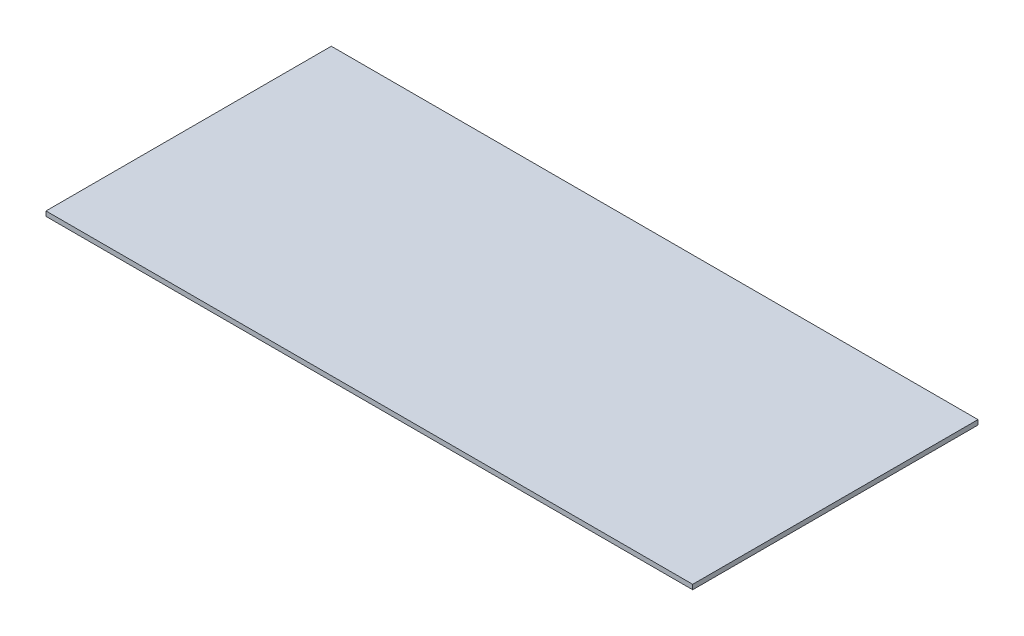
ISO-10303-21;
HEADER;
FILE_DESCRIPTION(('STEP AP214'),'2;1');
FILE_NAME('part.step','',(''),(''),'','','');
FILE_SCHEMA(('AUTOMOTIVE_DESIGN { 1 0 10303 214 1 1 1 1 }'));
ENDSEC;
DATA;
#1=APPLICATION_CONTEXT('core data for automotive mechanical design processes');
#2=APPLICATION_PROTOCOL_DEFINITION('international standard','automotive_design',2000,#1);
#3=PRODUCT_CONTEXT('',#1,'mechanical');
#4=PRODUCT('Part','Part','',(#3));
#5=PRODUCT_RELATED_PRODUCT_CATEGORY('part','',(#4));
#6=PRODUCT_DEFINITION_FORMATION('','',#4);
#7=PRODUCT_DEFINITION_CONTEXT('part definition',#1,'design');
#8=PRODUCT_DEFINITION('design','',#6,#7);
#9=PRODUCT_DEFINITION_SHAPE('','',#8);
#10=(LENGTH_UNIT() NAMED_UNIT(*) SI_UNIT(.MILLI.,.METRE.));
#11=(NAMED_UNIT(*) PLANE_ANGLE_UNIT() SI_UNIT($,.RADIAN.));
#12=(NAMED_UNIT(*) SI_UNIT($,.STERADIAN.) SOLID_ANGLE_UNIT());
#13=UNCERTAINTY_MEASURE_WITH_UNIT(LENGTH_MEASURE(1.E-05),#10,'distance_accuracy_value','');
#14=(GEOMETRIC_REPRESENTATION_CONTEXT(3) GLOBAL_UNCERTAINTY_ASSIGNED_CONTEXT((#13)) GLOBAL_UNIT_ASSIGNED_CONTEXT((#10,
#11,#12)) REPRESENTATION_CONTEXT('',''));
#15=CARTESIAN_POINT('',(0.,0.,0.));
#16=DIRECTION('',(0.,0.,1.));
#17=DIRECTION('',(1.,0.,0.));
#18=AXIS2_PLACEMENT_3D('',#15,#16,#17);
#19=CARTESIAN_POINT('',(340.,5.,150.));
#20=DIRECTION('',(-1.,0.,0.));
#21=DIRECTION('',(0.,0.,1.));
#22=AXIS2_PLACEMENT_3D('',#19,#20,#21);
#23=PLANE('',#22);
#24=DIRECTION('',(0.,0.,-1.));
#25=VECTOR('',#24,1.);
#26=CARTESIAN_POINT('',(340.,0.,150.));
#27=LINE('',#26,#25);
#28=CARTESIAN_POINT('',(340.,0.,150.));
#29=VERTEX_POINT('',#28);
#30=CARTESIAN_POINT('',(340.,0.,-150.));
#31=VERTEX_POINT('',#30);
#32=EDGE_CURVE('E96',#29,#31,#27,.T.);
#33=ORIENTED_EDGE('',*,*,#32,.T.);
#34=DIRECTION('',(0.,-1.,0.));
#35=VECTOR('',#34,1.);
#36=CARTESIAN_POINT('',(340.,5.,-150.));
#37=LINE('',#36,#35);
#38=CARTESIAN_POINT('',(340.,5.,-150.));
#39=VERTEX_POINT('',#38);
#40=EDGE_CURVE('E11',#39,#31,#37,.T.);
#41=ORIENTED_EDGE('',*,*,#40,.F.);
#42=DIRECTION('',(0.,0.,-1.));
#43=VECTOR('',#42,1.);
#44=CARTESIAN_POINT('',(340.,5.,150.));
#45=LINE('',#44,#43);
#46=CARTESIAN_POINT('',(340.,5.,150.));
#47=VERTEX_POINT('',#46);
#48=EDGE_CURVE('E84',#47,#39,#45,.T.);
#49=ORIENTED_EDGE('',*,*,#48,.F.);
#50=DIRECTION('',(0.,-1.,0.));
#51=VECTOR('',#50,1.);
#52=CARTESIAN_POINT('',(340.,5.,150.));
#53=LINE('',#52,#51);
#54=EDGE_CURVE('E92',#47,#29,#53,.T.);
#55=ORIENTED_EDGE('',*,*,#54,.T.);
#56=EDGE_LOOP('',(#33,#41,#49,#55));
#57=FACE_BOUND('',#56,.T.);
#58=ADVANCED_FACE('F33',(#57),#23,.F.);
#59=CARTESIAN_POINT('',(-340.,5.,-150.));
#60=DIRECTION('',(0.,0.,1.));
#61=DIRECTION('',(1.,0.,0.));
#62=AXIS2_PLACEMENT_3D('',#59,#60,#61);
#63=PLANE('',#62);
#64=DIRECTION('',(-1.,0.,0.));
#65=VECTOR('',#64,1.);
#66=CARTESIAN_POINT('',(-340.,0.,-150.));
#67=LINE('',#66,#65);
#68=CARTESIAN_POINT('',(-340.,0.,-150.));
#69=VERTEX_POINT('',#68);
#70=EDGE_CURVE('E88',#31,#69,#67,.T.);
#71=ORIENTED_EDGE('',*,*,#70,.T.);
#72=DIRECTION('',(0.,-1.,0.));
#73=VECTOR('',#72,1.);
#74=CARTESIAN_POINT('',(-340.,5.,-150.));
#75=LINE('',#74,#73);
#76=CARTESIAN_POINT('',(-340.,5.,-150.));
#77=VERTEX_POINT('',#76);
#78=EDGE_CURVE('E41',#77,#69,#75,.T.);
#79=ORIENTED_EDGE('',*,*,#78,.F.);
#80=DIRECTION('',(-1.,0.,0.));
#81=VECTOR('',#80,1.);
#82=CARTESIAN_POINT('',(-340.,5.,-150.));
#83=LINE('',#82,#81);
#84=EDGE_CURVE('E79',#39,#77,#83,.T.);
#85=ORIENTED_EDGE('',*,*,#84,.F.);
#86=ORIENTED_EDGE('',*,*,#40,.T.);
#87=EDGE_LOOP('',(#71,#79,#85,#86));
#88=FACE_BOUND('',#87,.T.);
#89=ADVANCED_FACE('F87',(#88),#63,.F.);
#90=CARTESIAN_POINT('',(-340.,5.,150.));
#91=DIRECTION('',(1.,0.,0.));
#92=DIRECTION('',(0.,0.,-1.));
#93=AXIS2_PLACEMENT_3D('',#90,#91,#92);
#94=PLANE('',#93);
#95=DIRECTION('',(0.,0.,1.));
#96=VECTOR('',#95,1.);
#97=CARTESIAN_POINT('',(-340.,0.,150.));
#98=LINE('',#97,#96);
#99=CARTESIAN_POINT('',(-340.,0.,150.));
#100=VERTEX_POINT('',#99);
#101=EDGE_CURVE('E66',#69,#100,#98,.T.);
#102=ORIENTED_EDGE('',*,*,#101,.T.);
#103=DIRECTION('',(0.,-1.,0.));
#104=VECTOR('',#103,1.);
#105=CARTESIAN_POINT('',(-340.,5.,150.));
#106=LINE('',#105,#104);
#107=CARTESIAN_POINT('',(-340.,5.,150.));
#108=VERTEX_POINT('',#107);
#109=EDGE_CURVE('E89',#108,#100,#106,.T.);
#110=ORIENTED_EDGE('',*,*,#109,.F.);
#111=DIRECTION('',(0.,0.,1.));
#112=VECTOR('',#111,1.);
#113=CARTESIAN_POINT('',(-340.,5.,150.));
#114=LINE('',#113,#112);
#115=EDGE_CURVE('E82',#77,#108,#114,.T.);
#116=ORIENTED_EDGE('',*,*,#115,.F.);
#117=ORIENTED_EDGE('',*,*,#78,.T.);
#118=EDGE_LOOP('',(#102,#110,#116,#117));
#119=FACE_BOUND('',#118,.T.);
#120=ADVANCED_FACE('F90',(#119),#94,.F.);
#121=CARTESIAN_POINT('',(-340.,5.,150.));
#122=DIRECTION('',(0.,0.,-1.));
#123=DIRECTION('',(-1.,0.,0.));
#124=AXIS2_PLACEMENT_3D('',#121,#122,#123);
#125=PLANE('',#124);
#126=DIRECTION('',(1.,0.,0.));
#127=VECTOR('',#126,1.);
#128=CARTESIAN_POINT('',(-340.,0.,150.));
#129=LINE('',#128,#127);
#130=EDGE_CURVE('E72',#100,#29,#129,.T.);
#131=ORIENTED_EDGE('',*,*,#130,.T.);
#132=ORIENTED_EDGE('',*,*,#54,.F.);
#133=DIRECTION('',(1.,0.,0.));
#134=VECTOR('',#133,1.);
#135=CARTESIAN_POINT('',(-340.,5.,150.));
#136=LINE('',#135,#134);
#137=EDGE_CURVE('E49',#108,#47,#136,.T.);
#138=ORIENTED_EDGE('',*,*,#137,.F.);
#139=ORIENTED_EDGE('',*,*,#109,.T.);
#140=EDGE_LOOP('',(#131,#132,#138,#139));
#141=FACE_BOUND('',#140,.T.);
#142=ADVANCED_FACE('F103',(#141),#125,.F.);
#143=CARTESIAN_POINT('',(0.,5.,0.));
#144=DIRECTION('',(0.,-1.,0.));
#145=DIRECTION('',(0.,0.,-1.));
#146=AXIS2_PLACEMENT_3D('',#143,#144,#145);
#147=PLANE('',#146);
#148=ORIENTED_EDGE('',*,*,#48,.T.);
#149=ORIENTED_EDGE('',*,*,#84,.T.);
#150=ORIENTED_EDGE('',*,*,#115,.T.);
#151=ORIENTED_EDGE('',*,*,#137,.T.);
#152=EDGE_LOOP('',(#148,#149,#150,#151));
#153=FACE_BOUND('',#152,.T.);
#154=ADVANCED_FACE('F80',(#153),#147,.F.);
#155=CARTESIAN_POINT('',(0.,0.,0.));
#156=DIRECTION('',(0.,-1.,0.));
#157=DIRECTION('',(0.,0.,-1.));
#158=AXIS2_PLACEMENT_3D('',#155,#156,#157);
#159=PLANE('',#158);
#160=ORIENTED_EDGE('',*,*,#32,.F.);
#161=ORIENTED_EDGE('',*,*,#130,.F.);
#162=ORIENTED_EDGE('',*,*,#101,.F.);
#163=ORIENTED_EDGE('',*,*,#70,.F.);
#164=EDGE_LOOP('',(#160,#161,#162,#163));
#165=FACE_BOUND('',#164,.T.);
#166=ADVANCED_FACE('F106',(#165),#159,.T.);
#167=CLOSED_SHELL('',(#58,#89,#120,#142,#154,#166));
#168=MANIFOLD_SOLID_BREP('B2',#167);
#169=ADVANCED_BREP_SHAPE_REPRESENTATION('',(#18,#168),#14);
#170=SHAPE_DEFINITION_REPRESENTATION(#9,#169);
ENDSEC;
END-ISO-10303-21;
